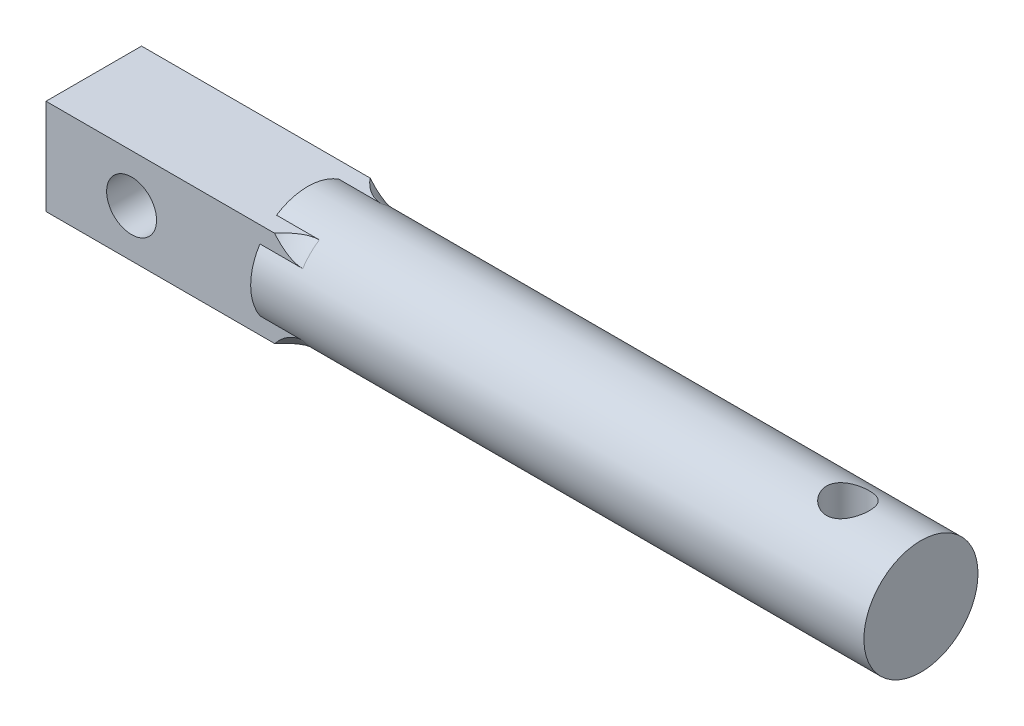
ISO-10303-21;
HEADER;
FILE_DESCRIPTION(('STEP AP214'),'2;1');
FILE_NAME('part.step','',(''),(''),'','','');
FILE_SCHEMA(('AUTOMOTIVE_DESIGN { 1 0 10303 214 1 1 1 1 }'));
ENDSEC;
DATA;
#1=APPLICATION_CONTEXT('core data for automotive mechanical design processes');
#2=APPLICATION_PROTOCOL_DEFINITION('international standard','automotive_design',2000,#1);
#3=PRODUCT_CONTEXT('',#1,'mechanical');
#4=PRODUCT('Part','Part','',(#3));
#5=PRODUCT_RELATED_PRODUCT_CATEGORY('part','',(#4));
#6=PRODUCT_DEFINITION_FORMATION('','',#4);
#7=PRODUCT_DEFINITION_CONTEXT('part definition',#1,'design');
#8=PRODUCT_DEFINITION('design','',#6,#7);
#9=PRODUCT_DEFINITION_SHAPE('','',#8);
#10=(LENGTH_UNIT() NAMED_UNIT(*) SI_UNIT(.MILLI.,.METRE.));
#11=(NAMED_UNIT(*) PLANE_ANGLE_UNIT() SI_UNIT($,.RADIAN.));
#12=(NAMED_UNIT(*) SI_UNIT($,.STERADIAN.) SOLID_ANGLE_UNIT());
#13=UNCERTAINTY_MEASURE_WITH_UNIT(LENGTH_MEASURE(1.E-05),#10,'distance_accuracy_value','');
#14=(GEOMETRIC_REPRESENTATION_CONTEXT(3) GLOBAL_UNCERTAINTY_ASSIGNED_CONTEXT((#13)) GLOBAL_UNIT_ASSIGNED_CONTEXT((#10,
#11,#12)) REPRESENTATION_CONTEXT('',''));
#15=CARTESIAN_POINT('',(0.,0.,0.));
#16=DIRECTION('',(0.,0.,1.));
#17=DIRECTION('',(1.,0.,0.));
#18=AXIS2_PLACEMENT_3D('',#15,#16,#17);
#19=CARTESIAN_POINT('',(15.,3.35,3.35));
#20=DIRECTION('',(0.,-1.,0.));
#21=DIRECTION('',(0.,0.,-1.));
#22=AXIS2_PLACEMENT_3D('',#19,#20,#21);
#23=PLANE('',#22);
#24=DIRECTION('',(0.,0.,1.));
#25=VECTOR('',#24,1.);
#26=CARTESIAN_POINT('',(0.,3.35,3.35));
#27=LINE('',#26,#25);
#28=CARTESIAN_POINT('',(0.,3.35,-3.35));
#29=VERTEX_POINT('',#28);
#30=CARTESIAN_POINT('',(0.,3.35,3.35));
#31=VERTEX_POINT('',#30);
#32=EDGE_CURVE('E175',#29,#31,#27,.T.);
#33=ORIENTED_EDGE('',*,*,#32,.T.);
#34=DIRECTION('',(-1.,0.,0.));
#35=VECTOR('',#34,1.);
#36=CARTESIAN_POINT('',(15.,3.35,3.35));
#37=LINE('',#36,#35);
#38=CARTESIAN_POINT('',(16.0298182633833,3.35,3.35));
#39=VERTEX_POINT('',#38);
#40=EDGE_CURVE('E210',#39,#31,#37,.T.);
#41=ORIENTED_EDGE('',*,*,#40,.F.);
#42=CARTESIAN_POINT('',(16.0298182633833,3.35,3.35));
#43=CARTESIAN_POINT('',(16.0864684037121,3.35,3.28027306898501));
#44=CARTESIAN_POINT('',(16.1451500411812,3.35,3.21216516056444));
#45=CARTESIAN_POINT('',(16.2667476247617,3.35,3.07960043262894));
#46=CARTESIAN_POINT('',(16.3296716300178,3.35,3.01515101654033));
#47=CARTESIAN_POINT('',(16.4611904339444,3.35,2.88916958772682));
#48=CARTESIAN_POINT('',(16.5298819895836,3.35,2.82773795819647));
#49=CARTESIAN_POINT('',(16.6717227758117,3.35,2.71035677698111));
#50=CARTESIAN_POINT('',(16.7448683503851,3.35,2.65440282484706));
#51=CARTESIAN_POINT('',(16.9173715419278,3.35,2.53411468810433));
#52=CARTESIAN_POINT('',(17.0182590141103,3.35,2.47193597557233));
#53=CARTESIAN_POINT('',(17.2270129609364,3.35,2.36293622665415));
#54=CARTESIAN_POINT('',(17.3347982269805,3.35,2.31596574994488));
#55=CARTESIAN_POINT('',(17.490124300729,3.35,2.26405391815088));
#56=CARTESIAN_POINT('',(17.5349457782523,3.35,2.25081761685032));
#57=CARTESIAN_POINT('',(17.6254639715211,3.35,2.22779978429815));
#58=CARTESIAN_POINT('',(17.6711603825218,3.35,2.21801707241332));
#59=CARTESIAN_POINT('',(17.7638357264803,3.35,2.20208445541903));
#60=CARTESIAN_POINT('',(17.8108236552808,3.35,2.19598645270394));
#61=CARTESIAN_POINT('',(17.9052031231599,3.35,2.18780488290379));
#62=CARTESIAN_POINT('',(17.9525950827968,3.35,2.18572619591083));
#63=CARTESIAN_POINT('',(18.,3.35,2.18574929943944));
#64=B_SPLINE_CURVE_WITH_KNOTS('',3,(#42,#43,#44,#45,#46,#47,#48,#49,#50,#51,#52,#53,#54,#55,#56,
#57,#58,#59,#60,#61,#62,#63),.UNSPECIFIED.,.F.,.F.,(4,2,2,2,2,2,2,2,2,2,4),(0.,
0.269515207064168,0.539557676680024,0.815773842281892,1.09176625886845,1.44640452379905,
1.79744407289377,1.93753871856879,2.07758542544657,2.21956142663324,2.36170970141409),.UNSPECIFIED.);
#65=CARTESIAN_POINT('',(18.,3.35,2.18574929943944));
#66=VERTEX_POINT('',#65);
#67=EDGE_CURVE('E276',#39,#66,#64,.T.);
#68=ORIENTED_EDGE('',*,*,#67,.T.);
#69=DIRECTION('',(-1.,0.,0.));
#70=VECTOR('',#69,1.);
#71=CARTESIAN_POINT('',(15.,3.35,2.18574929943944));
#72=LINE('',#71,#70);
#73=CARTESIAN_POINT('',(15.,3.35,2.18574929943944));
#74=VERTEX_POINT('',#73);
#75=EDGE_CURVE('E92',#74,#66,#72,.F.);
#76=ORIENTED_EDGE('',*,*,#75,.F.);
#77=DIRECTION('',(0.,0.,1.));
#78=VECTOR('',#77,1.);
#79=CARTESIAN_POINT('',(15.,3.35,3.35));
#80=LINE('',#79,#78);
#81=CARTESIAN_POINT('',(15.,3.35,-2.18574929943944));
#82=VERTEX_POINT('',#81);
#83=EDGE_CURVE('E190',#82,#74,#80,.T.);
#84=ORIENTED_EDGE('',*,*,#83,.F.);
#85=DIRECTION('',(-1.,0.,0.));
#86=VECTOR('',#85,1.);
#87=CARTESIAN_POINT('',(18.,3.35,-2.18574929943944));
#88=LINE('',#87,#86);
#89=CARTESIAN_POINT('',(18.,3.35,-2.18574929943944));
#90=VERTEX_POINT('',#89);
#91=EDGE_CURVE('E351',#90,#82,#88,.T.);
#92=ORIENTED_EDGE('',*,*,#91,.F.);
#93=CARTESIAN_POINT('',(18.,3.35,-2.18574929943944));
#94=CARTESIAN_POINT('',(17.9479455905589,3.35,-2.18571641481312));
#95=CARTESIAN_POINT('',(17.8959118505854,3.35,-2.18822771614914));
#96=CARTESIAN_POINT('',(17.7923879443542,3.35,-2.19808003791414));
#97=CARTESIAN_POINT('',(17.7408970164345,3.35,-2.20541299864629));
#98=CARTESIAN_POINT('',(17.6395649830739,3.35,-2.2245045328599));
#99=CARTESIAN_POINT('',(17.5897106900264,3.35,-2.23619375018783));
#100=CARTESIAN_POINT('',(17.49111990488,3.35,-2.26360631625521));
#101=CARTESIAN_POINT('',(17.4423839556105,3.35,-2.27933158072942));
#102=CARTESIAN_POINT('',(17.2639969725424,3.35,-2.34436337276396));
#103=CARTESIAN_POINT('',(17.1384072897377,3.35,-2.40513107514301));
#104=CARTESIAN_POINT('',(16.9578528173011,3.35,-2.51031831652521));
#105=CARTESIAN_POINT('',(16.8986432683331,3.35,-2.54798799146943));
#106=CARTESIAN_POINT('',(16.7829356163796,3.35,-2.62729090212239));
#107=CARTESIAN_POINT('',(16.7264365203935,3.35,-2.66892266934153));
#108=CARTESIAN_POINT('',(16.6112317730287,3.35,-2.75936551469728));
#109=CARTESIAN_POINT('',(16.5527710848299,3.35,-2.80848594324491));
#110=CARTESIAN_POINT('',(16.4388855584471,3.35,-2.91014412172528));
#111=CARTESIAN_POINT('',(16.3834613860711,3.35,-2.96268261564672));
#112=CARTESIAN_POINT('',(16.2767091834431,3.35,-3.06962183475399));
#113=CARTESIAN_POINT('',(16.2253203949553,3.35,-3.12396212986154));
#114=CARTESIAN_POINT('',(16.1254253940263,3.35,-3.23515920742571));
#115=CARTESIAN_POINT('',(16.076917044849,3.35,-3.29201406851448));
#116=CARTESIAN_POINT('',(16.0298182633833,3.35,-3.35));
#117=B_SPLINE_CURVE_WITH_KNOTS('',3,(#93,#94,#95,#96,#97,#98,#99,#100,#101,#102,#103,#104,#105,
#106,#107,#108,#109,#110,#111,#112,#113,#114,#115,#116),.UNSPECIFIED.,.F.,.F.,(4,2,2,2,2,2,2,2,
2,2,2,4),(0.,0.156069236862436,0.31187825545256,0.465305818504921,0.618806342015463,
1.03464476010719,1.24509374627984,1.45546503425158,1.68439273260899,1.91337042801419,
2.13764410724115,2.36174928460892),.UNSPECIFIED.);
#118=CARTESIAN_POINT('',(16.0298182633833,3.35,-3.35));
#119=VERTEX_POINT('',#118);
#120=EDGE_CURVE('E283',#90,#119,#117,.T.);
#121=ORIENTED_EDGE('',*,*,#120,.T.);
#122=DIRECTION('',(-1.,0.,0.));
#123=VECTOR('',#122,1.);
#124=CARTESIAN_POINT('',(15.,3.35,-3.35));
#125=LINE('',#124,#123);
#126=EDGE_CURVE('E84',#119,#29,#125,.T.);
#127=ORIENTED_EDGE('',*,*,#126,.T.);
#128=EDGE_LOOP('',(#33,#41,#68,#76,#84,#92,#121,#127));
#129=FACE_BOUND('',#128,.T.);
#130=ADVANCED_FACE('F45',(#129),#23,.F.);
#131=CARTESIAN_POINT('',(15.,-3.35,3.35));
#132=DIRECTION('',(0.,0.,-1.));
#133=DIRECTION('',(-1.,0.,0.));
#134=AXIS2_PLACEMENT_3D('',#131,#132,#133);
#135=PLANE('',#134);
#136=CARTESIAN_POINT('',(6.,0.,3.35));
#137=DIRECTION('',(0.,0.,-1.));
#138=DIRECTION('',(-1.,0.,0.));
#139=AXIS2_PLACEMENT_3D('',#136,#137,#138);
#140=CIRCLE('',#139,1.75);
#141=CARTESIAN_POINT('',(4.25,0.,3.35));
#142=VERTEX_POINT('',#141);
#143=EDGE_CURVE('E163',#142,#142,#140,.F.);
#144=ORIENTED_EDGE('',*,*,#143,.F.);
#145=EDGE_LOOP('',(#144));
#146=FACE_BOUND('',#145,.T.);
#147=DIRECTION('',(0.,-1.,0.));
#148=VECTOR('',#147,1.);
#149=CARTESIAN_POINT('',(0.,-3.35,3.35));
#150=LINE('',#149,#148);
#151=CARTESIAN_POINT('',(0.,-3.35,3.35));
#152=VERTEX_POINT('',#151);
#153=EDGE_CURVE('E198',#31,#152,#150,.T.);
#154=ORIENTED_EDGE('',*,*,#153,.T.);
#155=DIRECTION('',(-1.,0.,0.));
#156=VECTOR('',#155,1.);
#157=CARTESIAN_POINT('',(15.,-3.35,3.35));
#158=LINE('',#157,#156);
#159=CARTESIAN_POINT('',(16.0298182633833,-3.35,3.35));
#160=VERTEX_POINT('',#159);
#161=EDGE_CURVE('E207',#160,#152,#158,.T.);
#162=ORIENTED_EDGE('',*,*,#161,.F.);
#163=CARTESIAN_POINT('',(16.0298182633833,-3.35,3.35));
#164=CARTESIAN_POINT('',(16.0864684037121,-3.28027306898501,3.35));
#165=CARTESIAN_POINT('',(16.1451500411812,-3.21216516056444,3.35));
#166=CARTESIAN_POINT('',(16.2667476247617,-3.07960043262894,3.35));
#167=CARTESIAN_POINT('',(16.3296716300178,-3.01515101654033,3.35));
#168=CARTESIAN_POINT('',(16.4611904339444,-2.88916958772682,3.35));
#169=CARTESIAN_POINT('',(16.5298819895836,-2.82773795819647,3.35));
#170=CARTESIAN_POINT('',(16.6717227758117,-2.71035677698111,3.35));
#171=CARTESIAN_POINT('',(16.7448683503851,-2.65440282484706,3.35));
#172=CARTESIAN_POINT('',(16.9173715419278,-2.53411468810433,3.35));
#173=CARTESIAN_POINT('',(17.0182590141103,-2.47193597557233,3.35));
#174=CARTESIAN_POINT('',(17.2270129609364,-2.36293622665414,3.35));
#175=CARTESIAN_POINT('',(17.3347982269805,-2.31596574994488,3.35));
#176=CARTESIAN_POINT('',(17.490124300729,-2.26405391815088,3.35));
#177=CARTESIAN_POINT('',(17.5349457782523,-2.25081761685032,3.35));
#178=CARTESIAN_POINT('',(17.6254639715211,-2.22779978429814,3.35));
#179=CARTESIAN_POINT('',(17.6711603825218,-2.21801707241332,3.35));
#180=CARTESIAN_POINT('',(17.7638357264803,-2.20208445541903,3.35));
#181=CARTESIAN_POINT('',(17.8108236552808,-2.19598645270394,3.35));
#182=CARTESIAN_POINT('',(17.9052031231599,-2.18780488290379,3.35));
#183=CARTESIAN_POINT('',(17.9525950827968,-2.18572619591083,3.35));
#184=CARTESIAN_POINT('',(18.,-2.18574929943944,3.35));
#185=B_SPLINE_CURVE_WITH_KNOTS('',3,(#163,#164,#165,#166,#167,#168,#169,#170,#171,#172,#173,
#174,#175,#176,#177,#178,#179,#180,#181,#182,#183,#184),.UNSPECIFIED.,.F.,.F.,(4,2,2,2,2,2,2,2,
2,2,4),(0.,0.269515207064173,0.539557676680024,0.815773842281893,1.09176625886846,
1.44640452379905,1.79744407289377,1.9375387185688,2.07758542544657,2.21956142663324,
2.36170970141409),.UNSPECIFIED.);
#186=CARTESIAN_POINT('',(18.,-2.18574929943944,3.35));
#187=VERTEX_POINT('',#186);
#188=EDGE_CURVE('E315',#160,#187,#185,.T.);
#189=ORIENTED_EDGE('',*,*,#188,.T.);
#190=DIRECTION('',(-1.,0.,0.));
#191=VECTOR('',#190,1.);
#192=CARTESIAN_POINT('',(15.,-2.18574929943944,3.35));
#193=LINE('',#192,#191);
#194=CARTESIAN_POINT('',(15.,-2.18574929943944,3.35));
#195=VERTEX_POINT('',#194);
#196=EDGE_CURVE('E180',#195,#187,#193,.F.);
#197=ORIENTED_EDGE('',*,*,#196,.F.);
#198=DIRECTION('',(0.,-1.,0.));
#199=VECTOR('',#198,1.);
#200=CARTESIAN_POINT('',(15.,-3.35,3.35));
#201=LINE('',#200,#199);
#202=CARTESIAN_POINT('',(15.,2.18574929943944,3.35));
#203=VERTEX_POINT('',#202);
#204=EDGE_CURVE('E187',#203,#195,#201,.T.);
#205=ORIENTED_EDGE('',*,*,#204,.F.);
#206=DIRECTION('',(-1.,0.,0.));
#207=VECTOR('',#206,1.);
#208=CARTESIAN_POINT('',(18.,2.18574929943944,3.35));
#209=LINE('',#208,#207);
#210=CARTESIAN_POINT('',(18.,2.18574929943944,3.35));
#211=VERTEX_POINT('',#210);
#212=EDGE_CURVE('E184',#211,#203,#209,.T.);
#213=ORIENTED_EDGE('',*,*,#212,.F.);
#214=CARTESIAN_POINT('',(18.,2.18574929943944,3.35));
#215=CARTESIAN_POINT('',(17.9479455905589,2.18571641481312,3.35));
#216=CARTESIAN_POINT('',(17.8959118505854,2.18822771614914,3.35));
#217=CARTESIAN_POINT('',(17.7923879443542,2.19808003791414,3.35));
#218=CARTESIAN_POINT('',(17.7408970164346,2.20541299864629,3.35));
#219=CARTESIAN_POINT('',(17.6395649830739,2.2245045328599,3.35));
#220=CARTESIAN_POINT('',(17.5897106900264,2.23619375018783,3.35));
#221=CARTESIAN_POINT('',(17.49111990488,2.26360631625521,3.35));
#222=CARTESIAN_POINT('',(17.4423839556105,2.27933158072942,3.35));
#223=CARTESIAN_POINT('',(17.2639969725424,2.34436337276395,3.35));
#224=CARTESIAN_POINT('',(17.1384072897377,2.40513107514301,3.35));
#225=CARTESIAN_POINT('',(16.9578528173011,2.51031831652521,3.35));
#226=CARTESIAN_POINT('',(16.8986432683331,2.54798799146943,3.35));
#227=CARTESIAN_POINT('',(16.7829356163796,2.62729090212239,3.35));
#228=CARTESIAN_POINT('',(16.7264365203935,2.66892266934153,3.35));
#229=CARTESIAN_POINT('',(16.6112317730287,2.75936551469728,3.35));
#230=CARTESIAN_POINT('',(16.5527710848299,2.80848594324491,3.35));
#231=CARTESIAN_POINT('',(16.4388855584471,2.91014412172528,3.35));
#232=CARTESIAN_POINT('',(16.3834613860711,2.96268261564672,3.35));
#233=CARTESIAN_POINT('',(16.2767091834431,3.06962183475399,3.35));
#234=CARTESIAN_POINT('',(16.2253203949553,3.12396212986154,3.35));
#235=CARTESIAN_POINT('',(16.1254253940263,3.23515920742572,3.35));
#236=CARTESIAN_POINT('',(16.076917044849,3.29201406851448,3.35));
#237=CARTESIAN_POINT('',(16.0298182633833,3.35,3.35));
#238=B_SPLINE_CURVE_WITH_KNOTS('',3,(#214,#215,#216,#217,#218,#219,#220,#221,#222,#223,#224,
#225,#226,#227,#228,#229,#230,#231,#232,#233,#234,#235,#236,#237),.UNSPECIFIED.,.F.,.F.,(4,2,2,
2,2,2,2,2,2,2,2,4),(0.,0.156069236862433,0.31187825545256,0.465305818504924,0.618806342015463,
1.03464476010718,1.24509374627983,1.45546503425158,1.684392732609,1.91337042801419,
2.13764410724115,2.36174928460892),.UNSPECIFIED.);
#239=EDGE_CURVE('E308',#211,#39,#238,.T.);
#240=ORIENTED_EDGE('',*,*,#239,.T.);
#241=ORIENTED_EDGE('',*,*,#40,.T.);
#242=EDGE_LOOP('',(#154,#162,#189,#197,#205,#213,#240,#241));
#243=FACE_BOUND('',#242,.T.);
#244=ADVANCED_FACE('F259',(#146,#243),#135,.F.);
#245=CARTESIAN_POINT('',(15.,-3.35,3.35));
#246=DIRECTION('',(0.,1.,0.));
#247=DIRECTION('',(0.,0.,1.));
#248=AXIS2_PLACEMENT_3D('',#245,#246,#247);
#249=PLANE('',#248);
#250=DIRECTION('',(0.,0.,-1.));
#251=VECTOR('',#250,1.);
#252=CARTESIAN_POINT('',(0.,-3.35,3.35));
#253=LINE('',#252,#251);
#254=CARTESIAN_POINT('',(0.,-3.35,-3.35));
#255=VERTEX_POINT('',#254);
#256=EDGE_CURVE('E200',#152,#255,#253,.T.);
#257=ORIENTED_EDGE('',*,*,#256,.T.);
#258=DIRECTION('',(-1.,0.,0.));
#259=VECTOR('',#258,1.);
#260=CARTESIAN_POINT('',(15.,-3.35,-3.35));
#261=LINE('',#260,#259);
#262=CARTESIAN_POINT('',(16.0298182633833,-3.35,-3.35));
#263=VERTEX_POINT('',#262);
#264=EDGE_CURVE('E204',#263,#255,#261,.T.);
#265=ORIENTED_EDGE('',*,*,#264,.F.);
#266=CARTESIAN_POINT('',(16.0298182633833,-3.35,-3.35));
#267=CARTESIAN_POINT('',(16.0864684037121,-3.35,-3.28027306898501));
#268=CARTESIAN_POINT('',(16.1451500411812,-3.35,-3.21216516056444));
#269=CARTESIAN_POINT('',(16.2667476247617,-3.35,-3.07960043262894));
#270=CARTESIAN_POINT('',(16.3296716300178,-3.35,-3.01515101654033));
#271=CARTESIAN_POINT('',(16.4611904339444,-3.35,-2.88916958772682));
#272=CARTESIAN_POINT('',(16.5298819895836,-3.35,-2.82773795819647));
#273=CARTESIAN_POINT('',(16.6717227758117,-3.35,-2.71035677698111));
#274=CARTESIAN_POINT('',(16.7448683503851,-3.35,-2.65440282484706));
#275=CARTESIAN_POINT('',(16.9173715419278,-3.35,-2.53411468810433));
#276=CARTESIAN_POINT('',(17.0182590141103,-3.35,-2.47193597557233));
#277=CARTESIAN_POINT('',(17.2270129609364,-3.35,-2.36293622665415));
#278=CARTESIAN_POINT('',(17.3347982269805,-3.35,-2.31596574994488));
#279=CARTESIAN_POINT('',(17.490124300729,-3.35,-2.26405391815088));
#280=CARTESIAN_POINT('',(17.5349457782523,-3.35,-2.25081761685032));
#281=CARTESIAN_POINT('',(17.6254639715211,-3.35,-2.22779978429815));
#282=CARTESIAN_POINT('',(17.6711603825218,-3.35,-2.21801707241332));
#283=CARTESIAN_POINT('',(17.7638357264803,-3.35,-2.20208445541903));
#284=CARTESIAN_POINT('',(17.8108236552808,-3.35,-2.19598645270394));
#285=CARTESIAN_POINT('',(17.9052031231599,-3.35,-2.18780488290379));
#286=CARTESIAN_POINT('',(17.9525950827968,-3.35,-2.18572619591083));
#287=CARTESIAN_POINT('',(18.,-3.35,-2.18574929943944));
#288=B_SPLINE_CURVE_WITH_KNOTS('',3,(#266,#267,#268,#269,#270,#271,#272,#273,#274,#275,#276,
#277,#278,#279,#280,#281,#282,#283,#284,#285,#286,#287),.UNSPECIFIED.,.F.,.F.,(4,2,2,2,2,2,2,2,
2,2,4),(0.,0.269515207064168,0.539557676680024,0.815773842281892,1.09176625886845,
1.44640452379905,1.79744407289377,1.93753871856879,2.07758542544657,2.21956142663324,
2.36170970141409),.UNSPECIFIED.);
#289=CARTESIAN_POINT('',(18.,-3.35,-2.18574929943944));
#290=VERTEX_POINT('',#289);
#291=EDGE_CURVE('E11',#263,#290,#288,.T.);
#292=ORIENTED_EDGE('',*,*,#291,.T.);
#293=DIRECTION('',(-1.,0.,0.));
#294=VECTOR('',#293,1.);
#295=CARTESIAN_POINT('',(15.,-3.35,-2.18574929943944));
#296=LINE('',#295,#294);
#297=CARTESIAN_POINT('',(15.,-3.35,-2.18574929943944));
#298=VERTEX_POINT('',#297);
#299=EDGE_CURVE('E63',#298,#290,#296,.F.);
#300=ORIENTED_EDGE('',*,*,#299,.F.);
#301=DIRECTION('',(0.,0.,-1.));
#302=VECTOR('',#301,1.);
#303=CARTESIAN_POINT('',(15.,-3.35,3.35));
#304=LINE('',#303,#302);
#305=CARTESIAN_POINT('',(15.,-3.35,2.18574929943944));
#306=VERTEX_POINT('',#305);
#307=EDGE_CURVE('E159',#306,#298,#304,.T.);
#308=ORIENTED_EDGE('',*,*,#307,.F.);
#309=DIRECTION('',(-1.,0.,0.));
#310=VECTOR('',#309,1.);
#311=CARTESIAN_POINT('',(18.,-3.35,2.18574929943944));
#312=LINE('',#311,#310);
#313=CARTESIAN_POINT('',(18.,-3.35,2.18574929943944));
#314=VERTEX_POINT('',#313);
#315=EDGE_CURVE('E328',#314,#306,#312,.T.);
#316=ORIENTED_EDGE('',*,*,#315,.F.);
#317=CARTESIAN_POINT('',(18.,-3.35,2.18574929943944));
#318=CARTESIAN_POINT('',(17.9479455905589,-3.35,2.18571641481312));
#319=CARTESIAN_POINT('',(17.8959118505854,-3.35,2.18822771614914));
#320=CARTESIAN_POINT('',(17.7923879443542,-3.35,2.19808003791414));
#321=CARTESIAN_POINT('',(17.7408970164345,-3.35,2.20541299864629));
#322=CARTESIAN_POINT('',(17.6395649830739,-3.35,2.2245045328599));
#323=CARTESIAN_POINT('',(17.5897106900264,-3.35,2.23619375018783));
#324=CARTESIAN_POINT('',(17.49111990488,-3.35,2.26360631625521));
#325=CARTESIAN_POINT('',(17.4423839556105,-3.35,2.27933158072942));
#326=CARTESIAN_POINT('',(17.2639969725424,-3.35,2.34436337276396));
#327=CARTESIAN_POINT('',(17.1384072897377,-3.35,2.40513107514301));
#328=CARTESIAN_POINT('',(16.9578528173011,-3.35,2.51031831652521));
#329=CARTESIAN_POINT('',(16.8986432683331,-3.35,2.54798799146943));
#330=CARTESIAN_POINT('',(16.7829356163796,-3.35,2.62729090212239));
#331=CARTESIAN_POINT('',(16.7264365203935,-3.35,2.66892266934153));
#332=CARTESIAN_POINT('',(16.6112317730287,-3.35,2.75936551469728));
#333=CARTESIAN_POINT('',(16.5527710848299,-3.35,2.80848594324491));
#334=CARTESIAN_POINT('',(16.4388855584471,-3.35,2.91014412172528));
#335=CARTESIAN_POINT('',(16.3834613860711,-3.35,2.96268261564672));
#336=CARTESIAN_POINT('',(16.2767091834431,-3.35,3.06962183475399));
#337=CARTESIAN_POINT('',(16.2253203949553,-3.35,3.12396212986154));
#338=CARTESIAN_POINT('',(16.1254253940263,-3.35,3.23515920742571));
#339=CARTESIAN_POINT('',(16.076917044849,-3.35,3.29201406851448));
#340=CARTESIAN_POINT('',(16.0298182633833,-3.35,3.35));
#341=B_SPLINE_CURVE_WITH_KNOTS('',3,(#317,#318,#319,#320,#321,#322,#323,#324,#325,#326,#327,
#328,#329,#330,#331,#332,#333,#334,#335,#336,#337,#338,#339,#340),.UNSPECIFIED.,.F.,.F.,(4,2,2,
2,2,2,2,2,2,2,2,4),(0.,0.156069236862436,0.31187825545256,0.465305818504921,0.618806342015463,
1.03464476010719,1.24509374627984,1.45546503425158,1.68439273260899,1.91337042801419,
2.13764410724115,2.36174928460892),.UNSPECIFIED.);
#342=EDGE_CURVE('E321',#314,#160,#341,.T.);
#343=ORIENTED_EDGE('',*,*,#342,.T.);
#344=ORIENTED_EDGE('',*,*,#161,.T.);
#345=EDGE_LOOP('',(#257,#265,#292,#300,#308,#316,#343,#344));
#346=FACE_BOUND('',#345,.T.);
#347=ADVANCED_FACE('F263',(#346),#249,.F.);
#348=CARTESIAN_POINT('',(15.,-3.35,-3.35));
#349=DIRECTION('',(0.,0.,1.));
#350=DIRECTION('',(1.,0.,0.));
#351=AXIS2_PLACEMENT_3D('',#348,#349,#350);
#352=PLANE('',#351);
#353=CARTESIAN_POINT('',(6.,0.,-3.35));
#354=DIRECTION('',(0.,0.,1.));
#355=DIRECTION('',(1.,0.,0.));
#356=AXIS2_PLACEMENT_3D('',#353,#354,#355);
#357=CIRCLE('',#356,1.75);
#358=CARTESIAN_POINT('',(7.75,0.,-3.35));
#359=VERTEX_POINT('',#358);
#360=EDGE_CURVE('E51',#359,#359,#357,.F.);
#361=ORIENTED_EDGE('',*,*,#360,.F.);
#362=EDGE_LOOP('',(#361));
#363=FACE_BOUND('',#362,.T.);
#364=DIRECTION('',(0.,1.,0.));
#365=VECTOR('',#364,1.);
#366=CARTESIAN_POINT('',(0.,-3.35,-3.35));
#367=LINE('',#366,#365);
#368=EDGE_CURVE('E194',#255,#29,#367,.T.);
#369=ORIENTED_EDGE('',*,*,#368,.T.);
#370=ORIENTED_EDGE('',*,*,#126,.F.);
#371=CARTESIAN_POINT('',(16.0298182633833,3.35,-3.35));
#372=CARTESIAN_POINT('',(16.0864684037121,3.28027306898501,-3.35));
#373=CARTESIAN_POINT('',(16.1451500411812,3.21216516056444,-3.35));
#374=CARTESIAN_POINT('',(16.2667476247617,3.07960043262894,-3.35));
#375=CARTESIAN_POINT('',(16.3296716300178,3.01515101654033,-3.35));
#376=CARTESIAN_POINT('',(16.4611904339444,2.88916958772682,-3.35));
#377=CARTESIAN_POINT('',(16.5298819895836,2.82773795819647,-3.35));
#378=CARTESIAN_POINT('',(16.6717227758117,2.71035677698111,-3.35));
#379=CARTESIAN_POINT('',(16.7448683503851,2.65440282484706,-3.35));
#380=CARTESIAN_POINT('',(16.9173715419278,2.53411468810433,-3.35));
#381=CARTESIAN_POINT('',(17.0182590141103,2.47193597557233,-3.35));
#382=CARTESIAN_POINT('',(17.2270129609364,2.36293622665414,-3.35));
#383=CARTESIAN_POINT('',(17.3347982269805,2.31596574994488,-3.35));
#384=CARTESIAN_POINT('',(17.490124300729,2.26405391815088,-3.35));
#385=CARTESIAN_POINT('',(17.5349457782523,2.25081761685032,-3.35));
#386=CARTESIAN_POINT('',(17.6254639715211,2.22779978429814,-3.35));
#387=CARTESIAN_POINT('',(17.6711603825218,2.21801707241332,-3.35));
#388=CARTESIAN_POINT('',(17.7638357264803,2.20208445541903,-3.35));
#389=CARTESIAN_POINT('',(17.8108236552808,2.19598645270394,-3.35));
#390=CARTESIAN_POINT('',(17.9052031231599,2.18780488290379,-3.35));
#391=CARTESIAN_POINT('',(17.9525950827968,2.18572619591083,-3.35));
#392=CARTESIAN_POINT('',(18.,2.18574929943944,-3.35));
#393=B_SPLINE_CURVE_WITH_KNOTS('',3,(#371,#372,#373,#374,#375,#376,#377,#378,#379,#380,#381,
#382,#383,#384,#385,#386,#387,#388,#389,#390,#391,#392),.UNSPECIFIED.,.F.,.F.,(4,2,2,2,2,2,2,2,
2,2,4),(0.,0.269515207064173,0.539557676680024,0.815773842281893,1.09176625886846,
1.44640452379905,1.79744407289377,1.9375387185688,2.07758542544657,2.21956142663324,
2.36170970141409),.UNSPECIFIED.);
#394=CARTESIAN_POINT('',(18.,2.18574929943944,-3.35));
#395=VERTEX_POINT('',#394);
#396=EDGE_CURVE('E289',#119,#395,#393,.T.);
#397=ORIENTED_EDGE('',*,*,#396,.T.);
#398=DIRECTION('',(-1.,0.,0.));
#399=VECTOR('',#398,1.);
#400=CARTESIAN_POINT('',(15.,2.18574929943944,-3.35));
#401=LINE('',#400,#399);
#402=CARTESIAN_POINT('',(15.,2.18574929943944,-3.35));
#403=VERTEX_POINT('',#402);
#404=EDGE_CURVE('E154',#403,#395,#401,.F.);
#405=ORIENTED_EDGE('',*,*,#404,.F.);
#406=DIRECTION('',(0.,1.,0.));
#407=VECTOR('',#406,1.);
#408=CARTESIAN_POINT('',(15.,-3.35,-3.35));
#409=LINE('',#408,#407);
#410=CARTESIAN_POINT('',(15.,-2.18574929943944,-3.35));
#411=VERTEX_POINT('',#410);
#412=EDGE_CURVE('E156',#411,#403,#409,.T.);
#413=ORIENTED_EDGE('',*,*,#412,.F.);
#414=DIRECTION('',(-1.,0.,0.));
#415=VECTOR('',#414,1.);
#416=CARTESIAN_POINT('',(18.,-2.18574929943944,-3.35));
#417=LINE('',#416,#415);
#418=CARTESIAN_POINT('',(18.,-2.18574929943944,-3.35));
#419=VERTEX_POINT('',#418);
#420=EDGE_CURVE('E143',#419,#411,#417,.T.);
#421=ORIENTED_EDGE('',*,*,#420,.F.);
#422=CARTESIAN_POINT('',(18.,-2.18574929943944,-3.35));
#423=CARTESIAN_POINT('',(17.9479455905589,-2.18571641481312,-3.35));
#424=CARTESIAN_POINT('',(17.8959118505854,-2.18822771614914,-3.35));
#425=CARTESIAN_POINT('',(17.7923879443542,-2.19808003791414,-3.35));
#426=CARTESIAN_POINT('',(17.7408970164346,-2.20541299864629,-3.35));
#427=CARTESIAN_POINT('',(17.6395649830739,-2.2245045328599,-3.35));
#428=CARTESIAN_POINT('',(17.5897106900264,-2.23619375018783,-3.35));
#429=CARTESIAN_POINT('',(17.49111990488,-2.26360631625521,-3.35));
#430=CARTESIAN_POINT('',(17.4423839556105,-2.27933158072942,-3.35));
#431=CARTESIAN_POINT('',(17.2639969725424,-2.34436337276395,-3.35));
#432=CARTESIAN_POINT('',(17.1384072897377,-2.40513107514301,-3.35));
#433=CARTESIAN_POINT('',(16.9578528173011,-2.51031831652521,-3.35));
#434=CARTESIAN_POINT('',(16.8986432683331,-2.54798799146943,-3.35));
#435=CARTESIAN_POINT('',(16.7829356163796,-2.62729090212239,-3.35));
#436=CARTESIAN_POINT('',(16.7264365203935,-2.66892266934153,-3.35));
#437=CARTESIAN_POINT('',(16.6112317730287,-2.75936551469728,-3.35));
#438=CARTESIAN_POINT('',(16.5527710848299,-2.80848594324491,-3.35));
#439=CARTESIAN_POINT('',(16.4388855584471,-2.91014412172528,-3.35));
#440=CARTESIAN_POINT('',(16.3834613860711,-2.96268261564672,-3.35));
#441=CARTESIAN_POINT('',(16.2767091834431,-3.06962183475399,-3.35));
#442=CARTESIAN_POINT('',(16.2253203949553,-3.12396212986154,-3.35));
#443=CARTESIAN_POINT('',(16.1254253940263,-3.23515920742572,-3.35));
#444=CARTESIAN_POINT('',(16.076917044849,-3.29201406851448,-3.35));
#445=CARTESIAN_POINT('',(16.0298182633833,-3.35,-3.35));
#446=B_SPLINE_CURVE_WITH_KNOTS('',3,(#422,#423,#424,#425,#426,#427,#428,#429,#430,#431,#432,
#433,#434,#435,#436,#437,#438,#439,#440,#441,#442,#443,#444,#445),.UNSPECIFIED.,.F.,.F.,(4,2,2,
2,2,2,2,2,2,2,2,4),(0.,0.156069236862433,0.31187825545256,0.465305818504924,0.618806342015463,
1.03464476010718,1.24509374627983,1.45546503425158,1.684392732609,1.91337042801419,
2.13764410724115,2.36174928460892),.UNSPECIFIED.);
#447=EDGE_CURVE('E57',#419,#263,#446,.T.);
#448=ORIENTED_EDGE('',*,*,#447,.T.);
#449=ORIENTED_EDGE('',*,*,#264,.T.);
#450=EDGE_LOOP('',(#369,#370,#397,#405,#413,#421,#448,#449));
#451=FACE_BOUND('',#450,.T.);
#452=ADVANCED_FACE('F157',(#363,#451),#352,.F.);
#453=CARTESIAN_POINT('',(0.,0.,0.));
#454=DIRECTION('',(1.,0.,0.));
#455=DIRECTION('',(0.,0.,-1.));
#456=AXIS2_PLACEMENT_3D('',#453,#454,#455);
#457=PLANE('',#456);
#458=ORIENTED_EDGE('',*,*,#32,.F.);
#459=ORIENTED_EDGE('',*,*,#368,.F.);
#460=ORIENTED_EDGE('',*,*,#256,.F.);
#461=ORIENTED_EDGE('',*,*,#153,.F.);
#462=EDGE_LOOP('',(#458,#459,#460,#461));
#463=FACE_BOUND('',#462,.T.);
#464=ADVANCED_FACE('F250',(#463),#457,.F.);
#465=CARTESIAN_POINT('',(15.,0.,0.));
#466=DIRECTION('',(1.,0.,0.));
#467=DIRECTION('',(0.,0.,-1.));
#468=AXIS2_PLACEMENT_3D('',#465,#466,#467);
#469=PLANE('',#468);
#470=CARTESIAN_POINT('',(15.,0.,0.));
#471=DIRECTION('',(1.,0.,0.));
#472=DIRECTION('',(0.,0.,-1.));
#473=AXIS2_PLACEMENT_3D('',#470,#471,#472);
#474=CIRCLE('',#473,4.);
#475=EDGE_CURVE('E165',#82,#74,#474,.T.);
#476=ORIENTED_EDGE('',*,*,#475,.F.);
#477=ORIENTED_EDGE('',*,*,#83,.T.);
#478=EDGE_LOOP('',(#476,#477));
#479=FACE_BOUND('',#478,.T.);
#480=ADVANCED_FACE('F247',(#479),#469,.F.);
#481=EDGE_CURVE('E166',#203,#195,#474,.T.);
#482=ORIENTED_EDGE('',*,*,#481,.F.);
#483=ORIENTED_EDGE('',*,*,#204,.T.);
#484=EDGE_LOOP('',(#482,#483));
#485=FACE_BOUND('',#484,.T.);
#486=ADVANCED_FACE('F188',(#485),#469,.F.);
#487=EDGE_CURVE('E162',#306,#298,#474,.T.);
#488=ORIENTED_EDGE('',*,*,#487,.F.);
#489=ORIENTED_EDGE('',*,*,#307,.T.);
#490=EDGE_LOOP('',(#488,#489));
#491=FACE_BOUND('',#490,.T.);
#492=ADVANCED_FACE('F255',(#491),#469,.F.);
#493=EDGE_CURVE('E149',#411,#403,#474,.T.);
#494=ORIENTED_EDGE('',*,*,#493,.F.);
#495=ORIENTED_EDGE('',*,*,#412,.T.);
#496=EDGE_LOOP('',(#494,#495));
#497=FACE_BOUND('',#496,.T.);
#498=ADVANCED_FACE('F161',(#497),#469,.F.);
#499=CARTESIAN_POINT('',(58.,0.,0.));
#500=DIRECTION('',(-1.,0.,0.));
#501=DIRECTION('',(0.,0.,1.));
#502=AXIS2_PLACEMENT_3D('',#499,#500,#501);
#503=CYLINDRICAL_SURFACE('',#502,4.);
#504=CARTESIAN_POINT('',(51.38,-4.,0.));
#505=CARTESIAN_POINT('',(51.3799970976969,-4.00000217456151,0.0812350589378527));
#506=CARTESIAN_POINT('',(51.3866197602484,-3.99750379283184,0.162450241781792));
#507=CARTESIAN_POINT('',(51.4128281952699,-3.98778696006928,0.32245345235236));
#508=CARTESIAN_POINT('',(51.4324121004706,-3.98056918893993,0.401241827987615));
#509=CARTESIAN_POINT('',(51.4837530017718,-3.96218832391545,0.554060784990876));
#510=CARTESIAN_POINT('',(51.5154865168218,-3.9510328434944,0.628100224162273));
#511=CARTESIAN_POINT('',(51.5901064130158,-3.92588767765353,0.769799310160249));
#512=CARTESIAN_POINT('',(51.6329957855442,-3.91189723227548,0.837457239177876));
#513=CARTESIAN_POINT('',(51.7306125310709,-3.88186246971217,0.967346417045823));
#514=CARTESIAN_POINT('',(51.7857302622594,-3.86576002583566,1.02927073015119));
#515=CARTESIAN_POINT('',(51.9054104346588,-3.83360220871327,1.14324421474363));
#516=CARTESIAN_POINT('',(51.9699757560879,-3.81754685135033,1.19529036359202));
#517=CARTESIAN_POINT('',(52.1097174675232,-3.78662470617731,1.28998202215985));
#518=CARTESIAN_POINT('',(52.1852043665458,-3.77182648820818,1.33219393195759));
#519=CARTESIAN_POINT('',(52.3428483541685,-3.74599860237433,1.40318646334084));
#520=CARTESIAN_POINT('',(52.4250027631551,-3.73496742975881,1.43197244961239));
#521=CARTESIAN_POINT('',(52.5901167402582,-3.71854412824136,1.47408431017549));
#522=CARTESIAN_POINT('',(52.6729050384354,-3.71293924350838,1.48799593218557));
#523=CARTESIAN_POINT('',(52.8398161579938,-3.70738061461215,1.50179556531648));
#524=CARTESIAN_POINT('',(52.9239384138745,-3.70742453659305,1.5016893680263));
#525=CARTESIAN_POINT('',(53.085769525213,-3.71297511632055,1.48790429610018));
#526=CARTESIAN_POINT('',(53.1635609060442,-3.71815468871122,1.47503808509003));
#527=CARTESIAN_POINT('',(53.3157871504053,-3.7328493805953,1.4374416786833));
#528=CARTESIAN_POINT('',(53.3902215066139,-3.74236515298863,1.41270969663258));
#529=CARTESIAN_POINT('',(53.5352770677282,-3.76485702190253,1.35163748571904));
#530=CARTESIAN_POINT('',(53.6057994861213,-3.77789517988166,1.31508648737101));
#531=CARTESIAN_POINT('',(53.739945737591,-3.80594210139319,1.23156073762698));
#532=CARTESIAN_POINT('',(53.8035671775197,-3.82095154457158,1.18458238728896));
#533=CARTESIAN_POINT('',(53.9266036636509,-3.85248038859113,1.07781780766548));
#534=CARTESIAN_POINT('',(53.9854486407481,-3.86903347455671,1.01738298716955));
#535=CARTESIAN_POINT('',(54.0923379662058,-3.90091728164086,0.887312590819018));
#536=CARTESIAN_POINT('',(54.1403806546057,-3.91624781465952,0.817675603497361));
#537=CARTESIAN_POINT('',(54.2249303970625,-3.9442639480908,0.669723436992417));
#538=CARTESIAN_POINT('',(54.2612475812211,-3.95690498259616,0.591290713844716));
#539=CARTESIAN_POINT('',(54.31998260427,-3.97778718326962,0.428836850524581));
#540=CARTESIAN_POINT('',(54.3424066165611,-3.98603030341493,0.344818210845766));
#541=CARTESIAN_POINT('',(54.3716227875419,-3.99684443228065,0.178375243148665));
#542=CARTESIAN_POINT('',(54.3791826063825,-3.99969369025686,0.0961036195622097));
#543=CARTESIAN_POINT('',(54.3806910638999,-4.00025893700126,-0.0685724752550235));
#544=CARTESIAN_POINT('',(54.3746427203168,-3.99797606386863,-0.150976912983372));
#545=CARTESIAN_POINT('',(54.3496899576913,-3.98871709772643,-0.310262048561858));
#546=CARTESIAN_POINT('',(54.3312884562629,-3.98192470962305,-0.387233328007335));
#547=CARTESIAN_POINT('',(54.2828139274527,-3.96451477091717,-0.53694175495722));
#548=CARTESIAN_POINT('',(54.252739382052,-3.9538967228203,-0.609678350347533));
#549=CARTESIAN_POINT('',(54.1808135875605,-3.92949624407682,-0.751247765110153));
#550=CARTESIAN_POINT('',(54.1386422707766,-3.91563000209348,-0.819903083557792));
#551=CARTESIAN_POINT('',(54.0440818968284,-3.88626671564664,-0.949392711726622));
#552=CARTESIAN_POINT('',(53.9916890674548,-3.87076907009516,-1.01022412027045));
#553=CARTESIAN_POINT('',(53.8745958778757,-3.8387332949099,-1.12603079874454));
#554=CARTESIAN_POINT('',(53.8093578172273,-3.82218696503729,-1.18046154123568));
#555=CARTESIAN_POINT('',(53.6703486152923,-3.79078815746854,-1.27771050031903));
#556=CARTESIAN_POINT('',(53.5965767086115,-3.77593583194399,-1.32052767414518));
#557=CARTESIAN_POINT('',(53.4419840132277,-3.74966829822463,-1.39337773518997));
#558=CARTESIAN_POINT('',(53.3611352540896,-3.73826760328494,-1.42335685446918));
#559=CARTESIAN_POINT('',(53.1949902363122,-3.72054032891005,-1.46907883466889));
#560=CARTESIAN_POINT('',(53.1096967638019,-3.71421061057491,-1.48483050305535));
#561=CARTESIAN_POINT('',(52.9429838404589,-3.70775894792574,-1.50086347097839));
#562=CARTESIAN_POINT('',(52.8616673682831,-3.70726444523341,-1.50207331495837));
#563=CARTESIAN_POINT('',(52.7000546837238,-3.71158412745292,-1.49136715641592));
#564=CARTESIAN_POINT('',(52.6197583753284,-3.71639780898899,-1.47945239850123));
#565=CARTESIAN_POINT('',(52.4649527732834,-3.73048141585433,-1.44355815630241));
#566=CARTESIAN_POINT('',(52.3903416537547,-3.73961085376663,-1.41995798316524));
#567=CARTESIAN_POINT('',(52.2460944915056,-3.76121548297845,-1.36169696779919));
#568=CARTESIAN_POINT('',(52.1764597119299,-3.77369151995215,-1.32703332944944));
#569=CARTESIAN_POINT('',(52.0401732103024,-3.80139723903965,-1.24552075938153));
#570=CARTESIAN_POINT('',(51.9738692032001,-3.81673698440964,-1.1981283280301));
#571=CARTESIAN_POINT('',(51.8498584390288,-3.84806246757177,-1.09334485729906));
#572=CARTESIAN_POINT('',(51.7921544252133,-3.86404840943145,-1.03595064012808));
#573=CARTESIAN_POINT('',(51.6837980441782,-3.89590424609881,-0.90908039678462));
#574=CARTESIAN_POINT('',(51.6336962465653,-3.91172104900645,-0.839118644212991));
#575=CARTESIAN_POINT('',(51.5459773447234,-3.94054514457031,-0.691213223200821));
#576=CARTESIAN_POINT('',(51.5083612122636,-3.95355221851559,-0.613268934090622));
#577=CARTESIAN_POINT('',(51.4456231709517,-3.9757429260668,-0.447999082002313));
#578=CARTESIAN_POINT('',(51.4211129353981,-3.98473657158356,-0.360413422234209));
#579=CARTESIAN_POINT('',(51.3883070400793,-3.99686242179587,-0.181875733606382));
#580=CARTESIAN_POINT('',(51.3800032485127,-3.99999756603967,-0.0909254163648589));
#581=CARTESIAN_POINT('',(51.38,-4.,0.));
#582=B_SPLINE_CURVE_WITH_KNOTS('',3,(#504,#505,#506,#507,#508,#509,#510,#511,#512,#513,#514,
#515,#516,#517,#518,#519,#520,#521,#522,#523,#524,#525,#526,#527,#528,#529,#530,#531,#532,#533,
#534,#535,#536,#537,#538,#539,#540,#541,#542,#543,#544,#545,#546,#547,#548,#549,#550,#551,#552,
#553,#554,#555,#556,#557,#558,#559,#560,#561,#562,#563,#564,#565,#566,#567,#568,#569,#570,#571,
#572,#573,#574,#575,#576,#577,#578,#579,#580,#581),.UNSPECIFIED.,.T.,.F.,(4,2,2,2,2,2,2,2,2,2,2,
2,2,2,2,2,2,2,2,2,2,2,2,2,2,2,2,2,2,2,2,2,2,2,2,2,2,2,4),(0.,0.243369801560559,
0.486704549530459,0.729571369213567,0.972503379609487,1.22473618582715,1.47704604925621,
1.73896674501659,2.00078269352134,2.25185874416901,2.50283106079707,2.7387834511997,
2.97477138060587,3.21522408387017,3.45575990744258,3.71246153335812,3.96920257905065,
4.22991375286074,4.49050899698844,4.73725019635924,4.98393668390519,5.22114437923839,
5.45838293254452,5.70259221859598,5.94689180019866,6.20536519455656,6.46386178920139,
6.72343066727201,6.98283874956505,7.2255876348025,7.46831350211257,7.70363142426532,
7.93900886656505,8.18672471884268,8.4345194199706,8.69572329654037,8.95694749805099,
9.2294851503204,9.50188601796125),.UNSPECIFIED.);
#583=CARTESIAN_POINT('',(51.38,-4.,0.));
#584=VERTEX_POINT('',#583);
#585=EDGE_CURVE('E221',#584,#584,#582,.T.);
#586=ORIENTED_EDGE('',*,*,#585,.T.);
#587=EDGE_LOOP('',(#586));
#588=FACE_BOUND('',#587,.T.);
#589=CARTESIAN_POINT('',(52.88,3.70809924354783,1.5));
#590=CARTESIAN_POINT('',(52.7989925162792,3.70809640633806,1.50000304106109));
#591=CARTESIAN_POINT('',(52.7180050774964,3.71078260240986,1.49341597549487));
#592=CARTESIAN_POINT('',(52.5584719170868,3.72116159304967,1.46736187895467));
#593=CARTESIAN_POINT('',(52.479926122405,3.72885423767112,1.44789523373263));
#594=CARTESIAN_POINT('',(52.3276246283865,3.748254802809,1.39689657610573));
#595=CARTESIAN_POINT('',(52.2538579433489,3.7599530956926,1.36539347266348));
#596=CARTESIAN_POINT('',(52.1126281031812,3.78603134206599,1.29131856742697));
#597=CARTESIAN_POINT('',(52.0451668497175,3.80041210067323,1.24874344095038));
#598=CARTESIAN_POINT('',(51.9151096883772,3.83103574665713,1.15146661374162));
#599=CARTESIAN_POINT('',(51.8528714703706,3.84733341923604,1.09630381213306));
#600=CARTESIAN_POINT('',(51.7382771853285,3.87949750628547,0.976395839778922));
#601=CARTESIAN_POINT('',(51.6859232262581,3.89536382814785,0.911648630256677));
#602=CARTESIAN_POINT('',(51.5908604877044,3.92552873936553,0.771694655177599));
#603=CARTESIAN_POINT('',(51.5485405252841,3.93975561223505,0.696206947538027));
#604=CARTESIAN_POINT('',(51.4773488274751,3.96438007973848,0.538555771965247));
#605=CARTESIAN_POINT('',(51.448472428008,3.97477900217006,0.456394630933535));
#606=CARTESIAN_POINT('',(51.4062421042254,3.9901869710344,0.291489341676832));
#607=CARTESIAN_POINT('',(51.3922723725595,3.99540915214774,0.208923197281596));
#608=CARTESIAN_POINT('',(51.378278799055,4.0006401410794,0.042464363794787));
#609=CARTESIAN_POINT('',(51.3782504223813,4.00065064414902,-0.0414278850628318));
#610=CARTESIAN_POINT('',(51.3917817614652,3.99559265903894,-0.203743543064474));
#611=CARTESIAN_POINT('',(51.4046692979488,3.99077541996683,-0.282232178266898));
#612=CARTESIAN_POINT('',(51.4425359152255,3.97693274932263,-0.435839217984389));
#613=CARTESIAN_POINT('',(51.467515852262,3.96790701975578,-0.510957383430297));
#614=CARTESIAN_POINT('',(51.5291704516758,3.94637769167531,-0.656989017303101));
#615=CARTESIAN_POINT('',(51.5660100052684,3.93382539470077,-0.727825392287305));
#616=CARTESIAN_POINT('',(51.6501920969294,3.90651310225279,-0.862486607957554));
#617=CARTESIAN_POINT('',(51.6975380230176,3.8917523951284,-0.926309176932319));
#618=CARTESIAN_POINT('',(51.8046272862832,3.86052529655816,-1.04909048680093));
#619=CARTESIAN_POINT('',(51.8649339156504,3.84400963763883,-1.10754614526348));
#620=CARTESIAN_POINT('',(51.9945929933216,3.81182460645722,-1.21370395569342));
#621=CARTESIAN_POINT('',(52.0639477065866,3.79615544748847,-1.26140340692899));
#622=CARTESIAN_POINT('',(52.2117194674628,3.76712703500335,-1.34565611808151));
#623=CARTESIAN_POINT('',(52.2903034936861,3.75382677150277,-1.38193847851831));
#624=CARTESIAN_POINT('',(52.4530962251676,3.73172438629003,-1.44056464441501));
#625=CARTESIAN_POINT('',(52.5373017715937,3.72291976205783,-1.46291620605595));
#626=CARTESIAN_POINT('',(52.703975962316,3.71139597222848,-1.49190191709668));
#627=CARTESIAN_POINT('',(52.7862841055361,3.70836785241537,-1.49933521158966));
#628=CARTESIAN_POINT('',(52.9510093567417,3.70786539525016,-1.50057885636272));
#629=CARTESIAN_POINT('',(53.0334264323525,3.71038967003987,-1.49439261093761));
#630=CARTESIAN_POINT('',(53.1919299222877,3.72039381629735,-1.46929733520156));
#631=CARTESIAN_POINT('',(53.2681311357647,3.72763276216449,-1.45100618334224));
#632=CARTESIAN_POINT('',(53.4163479447202,3.74596487046362,-1.40299774640637));
#633=CARTESIAN_POINT('',(53.4883626791681,3.75705882250173,-1.37327812034622));
#634=CARTESIAN_POINT('',(53.6291644380762,3.7823624311608,-1.30200292275277));
#635=CARTESIAN_POINT('',(53.6977292921373,3.79667328892065,-1.26004545177046));
#636=CARTESIAN_POINT('',(53.827128981726,3.82662814294291,-1.16591317862479));
#637=CARTESIAN_POINT('',(53.8879609746246,3.84227262594077,-1.11373463696434));
#638=CARTESIAN_POINT('',(54.0041683731951,3.87433046553184,-0.996727340900931));
#639=CARTESIAN_POINT('',(54.0589534087688,3.89072969357028,-0.931306341491054));
#640=CARTESIAN_POINT('',(54.1568383675894,3.92149874963302,-0.791797471753144));
#641=CARTESIAN_POINT('',(54.1999382529458,3.93586857107664,-0.717709573322669));
#642=CARTESIAN_POINT('',(54.2729460561996,3.96094985704552,-0.563016329468474));
#643=CARTESIAN_POINT('',(54.3028991237926,3.9716738133801,-0.482434433064624));
#644=CARTESIAN_POINT('',(54.3486564138499,3.98829436712571,-0.316881887523254));
#645=CARTESIAN_POINT('',(54.3644672854224,3.99419323299412,-0.231913320723593));
#646=CARTESIAN_POINT('',(54.3807744027548,4.00028407317073,-0.0653355852738172));
#647=CARTESIAN_POINT('',(54.382109483059,4.00078860953764,0.0161807680608438));
#648=CARTESIAN_POINT('',(54.3715848405546,3.99684889809224,0.178226786412423));
#649=CARTESIAN_POINT('',(54.3597267091141,3.9924052471313,0.258756569245257));
#650=CARTESIAN_POINT('',(54.3237411485064,3.97921089603771,0.414548248377125));
#651=CARTESIAN_POINT('',(54.2999200941216,3.97056791378017,0.489890731068833));
#652=CARTESIAN_POINT('',(54.2409899866156,3.9498778362099,0.635515473006388));
#653=CARTESIAN_POINT('',(54.2058787966952,3.93783009655664,0.705796771275541));
#654=CARTESIAN_POINT('',(54.1236860564952,3.91090618300074,0.842540176994411));
#655=CARTESIAN_POINT('',(54.0761633594858,3.89593240108829,0.908717548846847));
#656=CARTESIAN_POINT('',(53.9711921698124,3.86499507694844,1.03241734752336));
#657=CARTESIAN_POINT('',(53.9137401341921,3.84903118274027,1.0899366712559));
#658=CARTESIAN_POINT('',(53.7869358683549,3.81688129739175,1.19781214236195));
#659=CARTESIAN_POINT('',(53.7171155978457,3.8007280534916,1.24762999816025));
#660=CARTESIAN_POINT('',(53.5695841304267,3.77098325003638,1.33484709556843));
#661=CARTESIAN_POINT('',(53.4918721159465,3.75739195631217,1.37224504878156));
#662=CARTESIAN_POINT('',(53.3270443190246,3.73402269853266,1.4346588697426));
#663=CARTESIAN_POINT('',(53.2396656334882,3.7244380329086,1.45906002899522));
#664=CARTESIAN_POINT('',(53.0615147280442,3.71147994336315,1.49172356722079));
#665=CARTESIAN_POINT('',(52.97074478729,3.70810242179736,1.4999965933957));
#666=CARTESIAN_POINT('',(52.88,3.70809924354783,1.5));
#667=B_SPLINE_CURVE_WITH_KNOTS('',3,(#589,#590,#591,#592,#593,#594,#595,#596,#597,#598,#599,
#600,#601,#602,#603,#604,#605,#606,#607,#608,#609,#610,#611,#612,#613,#614,#615,#616,#617,#618,
#619,#620,#621,#622,#623,#624,#625,#626,#627,#628,#629,#630,#631,#632,#633,#634,#635,#636,#637,
#638,#639,#640,#641,#642,#643,#644,#645,#646,#647,#648,#649,#650,#651,#652,#653,#654,#655,#656,
#657,#658,#659,#660,#661,#662,#663,#664,#665,#666),.UNSPECIFIED.,.T.,.F.,(4,2,2,2,2,2,2,2,2,2,2,
2,2,2,2,2,2,2,2,2,2,2,2,2,2,2,2,2,2,2,2,2,2,2,2,2,2,2,4),(0.,0.242684541416171,
0.485361814598854,0.727459856757033,0.969630679682934,1.22274652401128,1.47591628822983,
1.73770072136421,1.99939426381329,2.24980018489678,2.50012465404856,2.73806472803193,
2.97602165263334,3.21744131210667,3.45893893628974,3.71456675065874,3.97025867827334,
4.23162592252965,4.49284751635474,4.73965657740485,4.98640395388884,5.22143845928198,
5.45652113429525,5.7004156100582,5.94439948466354,6.20385016993623,6.46330169650177,
6.72185508890167,6.98028685560125,7.22365720549934,7.46699820319478,7.70440274003889,
7.94185223512829,8.18928323676985,8.43680270894962,8.69738599542076,8.9579963054424,
9.23003178870924,9.50188762323051),.UNSPECIFIED.);
#668=CARTESIAN_POINT('',(52.88,3.70809924354783,1.5));
#669=VERTEX_POINT('',#668);
#670=EDGE_CURVE('E213',#669,#669,#667,.T.);
#671=ORIENTED_EDGE('',*,*,#670,.T.);
#672=EDGE_LOOP('',(#671));
#673=FACE_BOUND('',#672,.T.);
#674=CARTESIAN_POINT('',(58.,0.,0.));
#675=DIRECTION('',(1.,0.,0.));
#676=DIRECTION('',(0.,0.,-1.));
#677=AXIS2_PLACEMENT_3D('',#674,#675,#676);
#678=CIRCLE('',#677,4.);
#679=CARTESIAN_POINT('',(58.,0.,-4.));
#680=VERTEX_POINT('',#679);
#681=EDGE_CURVE('E171',#680,#680,#678,.T.);
#682=ORIENTED_EDGE('',*,*,#681,.F.);
#683=EDGE_LOOP('',(#682));
#684=FACE_BOUND('',#683,.T.);
#685=CARTESIAN_POINT('',(18.,0.,0.));
#686=DIRECTION('',(1.,0.,0.));
#687=DIRECTION('',(0.,0.,-1.));
#688=AXIS2_PLACEMENT_3D('',#685,#686,#687);
#689=CIRCLE('',#688,4.);
#690=EDGE_CURVE('E359',#187,#314,#689,.T.);
#691=ORIENTED_EDGE('',*,*,#690,.T.);
#692=ORIENTED_EDGE('',*,*,#315,.T.);
#693=ORIENTED_EDGE('',*,*,#487,.T.);
#694=ORIENTED_EDGE('',*,*,#299,.T.);
#695=CARTESIAN_POINT('',(18.,0.,0.));
#696=DIRECTION('',(1.,0.,0.));
#697=DIRECTION('',(0.,0.,-1.));
#698=AXIS2_PLACEMENT_3D('',#695,#696,#697);
#699=CIRCLE('',#698,4.);
#700=EDGE_CURVE('E152',#290,#419,#699,.T.);
#701=ORIENTED_EDGE('',*,*,#700,.T.);
#702=ORIENTED_EDGE('',*,*,#420,.T.);
#703=ORIENTED_EDGE('',*,*,#493,.T.);
#704=ORIENTED_EDGE('',*,*,#404,.T.);
#705=CARTESIAN_POINT('',(18.,0.,0.));
#706=DIRECTION('',(1.,0.,0.));
#707=DIRECTION('',(0.,0.,-1.));
#708=AXIS2_PLACEMENT_3D('',#705,#706,#707);
#709=CIRCLE('',#708,4.);
#710=EDGE_CURVE('E348',#395,#90,#709,.T.);
#711=ORIENTED_EDGE('',*,*,#710,.T.);
#712=ORIENTED_EDGE('',*,*,#91,.T.);
#713=ORIENTED_EDGE('',*,*,#475,.T.);
#714=ORIENTED_EDGE('',*,*,#75,.T.);
#715=CARTESIAN_POINT('',(18.,0.,0.));
#716=DIRECTION('',(1.,0.,0.));
#717=DIRECTION('',(0.,0.,-1.));
#718=AXIS2_PLACEMENT_3D('',#715,#716,#717);
#719=CIRCLE('',#718,4.);
#720=EDGE_CURVE('E356',#66,#211,#719,.T.);
#721=ORIENTED_EDGE('',*,*,#720,.T.);
#722=ORIENTED_EDGE('',*,*,#212,.T.);
#723=ORIENTED_EDGE('',*,*,#481,.T.);
#724=ORIENTED_EDGE('',*,*,#196,.T.);
#725=EDGE_LOOP('',(#691,#692,#693,#694,#701,#702,#703,#704,#711,#712,#713,#714,#721,#722,#723,#724));
#726=FACE_BOUND('',#725,.T.);
#727=ADVANCED_FACE('F146',(#588,#673,#684,#726),#503,.T.);
#728=CARTESIAN_POINT('',(58.,0.,0.));
#729=DIRECTION('',(1.,0.,0.));
#730=DIRECTION('',(0.,0.,-1.));
#731=AXIS2_PLACEMENT_3D('',#728,#729,#730);
#732=PLANE('',#731);
#733=ORIENTED_EDGE('',*,*,#681,.T.);
#734=EDGE_LOOP('',(#733));
#735=FACE_BOUND('',#734,.T.);
#736=ADVANCED_FACE('F239',(#735),#732,.T.);
#737=CARTESIAN_POINT('',(52.88,-4.,0.));
#738=DIRECTION('',(0.,1.,0.));
#739=DIRECTION('',(0.,0.,1.));
#740=AXIS2_PLACEMENT_3D('',#737,#738,#739);
#741=CYLINDRICAL_SURFACE('',#740,1.5);
#742=ORIENTED_EDGE('',*,*,#670,.F.);
#743=EDGE_LOOP('',(#742));
#744=FACE_BOUND('',#743,.T.);
#745=ORIENTED_EDGE('',*,*,#585,.F.);
#746=EDGE_LOOP('',(#745));
#747=FACE_BOUND('',#746,.T.);
#748=ADVANCED_FACE('F231',(#744,#747),#741,.F.);
#749=CARTESIAN_POINT('',(18.,0.,0.));
#750=DIRECTION('',(1.,0.,0.));
#751=DIRECTION('',(0.,0.,-1.));
#752=AXIS2_PLACEMENT_3D('',#749,#750,#751);
#753=TOROIDAL_SURFACE('',#752,7.,3.);
#754=ORIENTED_EDGE('',*,*,#690,.F.);
#755=ORIENTED_EDGE('',*,*,#188,.F.);
#756=ORIENTED_EDGE('',*,*,#342,.F.);
#757=EDGE_LOOP('',(#754,#755,#756));
#758=FACE_BOUND('',#757,.T.);
#759=ADVANCED_FACE('F238',(#758),#753,.F.);
#760=CARTESIAN_POINT('',(18.,0.,0.));
#761=DIRECTION('',(1.,0.,0.));
#762=DIRECTION('',(0.,0.,-1.));
#763=AXIS2_PLACEMENT_3D('',#760,#761,#762);
#764=TOROIDAL_SURFACE('',#763,7.,3.);
#765=ORIENTED_EDGE('',*,*,#720,.F.);
#766=ORIENTED_EDGE('',*,*,#67,.F.);
#767=ORIENTED_EDGE('',*,*,#239,.F.);
#768=EDGE_LOOP('',(#765,#766,#767));
#769=FACE_BOUND('',#768,.T.);
#770=ADVANCED_FACE('F301',(#769),#764,.F.);
#771=CARTESIAN_POINT('',(18.,0.,0.));
#772=DIRECTION('',(1.,0.,0.));
#773=DIRECTION('',(0.,0.,-1.));
#774=AXIS2_PLACEMENT_3D('',#771,#772,#773);
#775=TOROIDAL_SURFACE('',#774,7.,3.);
#776=ORIENTED_EDGE('',*,*,#710,.F.);
#777=ORIENTED_EDGE('',*,*,#396,.F.);
#778=ORIENTED_EDGE('',*,*,#120,.F.);
#779=EDGE_LOOP('',(#776,#777,#778));
#780=FACE_BOUND('',#779,.T.);
#781=ADVANCED_FACE('F297',(#780),#775,.F.);
#782=CARTESIAN_POINT('',(18.,0.,0.));
#783=DIRECTION('',(1.,0.,0.));
#784=DIRECTION('',(0.,0.,-1.));
#785=AXIS2_PLACEMENT_3D('',#782,#783,#784);
#786=TOROIDAL_SURFACE('',#785,7.,3.);
#787=ORIENTED_EDGE('',*,*,#700,.F.);
#788=ORIENTED_EDGE('',*,*,#291,.F.);
#789=ORIENTED_EDGE('',*,*,#447,.F.);
#790=EDGE_LOOP('',(#787,#788,#789));
#791=FACE_BOUND('',#790,.T.);
#792=ADVANCED_FACE('F48',(#791),#786,.F.);
#793=CARTESIAN_POINT('',(6.,0.,-4.));
#794=DIRECTION('',(0.,0.,1.));
#795=DIRECTION('',(1.,0.,0.));
#796=AXIS2_PLACEMENT_3D('',#793,#794,#795);
#797=CYLINDRICAL_SURFACE('',#796,1.75);
#798=ORIENTED_EDGE('',*,*,#360,.T.);
#799=EDGE_LOOP('',(#798));
#800=FACE_BOUND('',#799,.T.);
#801=ORIENTED_EDGE('',*,*,#143,.T.);
#802=EDGE_LOOP('',(#801));
#803=FACE_BOUND('',#802,.T.);
#804=ADVANCED_FACE('F242',(#800,#803),#797,.F.);
#805=CLOSED_SHELL('',(#130,#244,#347,#452,#464,#480,#486,#492,#498,#727,#736,#748,#759,#770,
#781,#792,#804));
#806=MANIFOLD_SOLID_BREP('B2',#805);
#807=ADVANCED_BREP_SHAPE_REPRESENTATION('',(#18,#806),#14);
#808=SHAPE_DEFINITION_REPRESENTATION(#9,#807);
ENDSEC;
END-ISO-10303-21;
